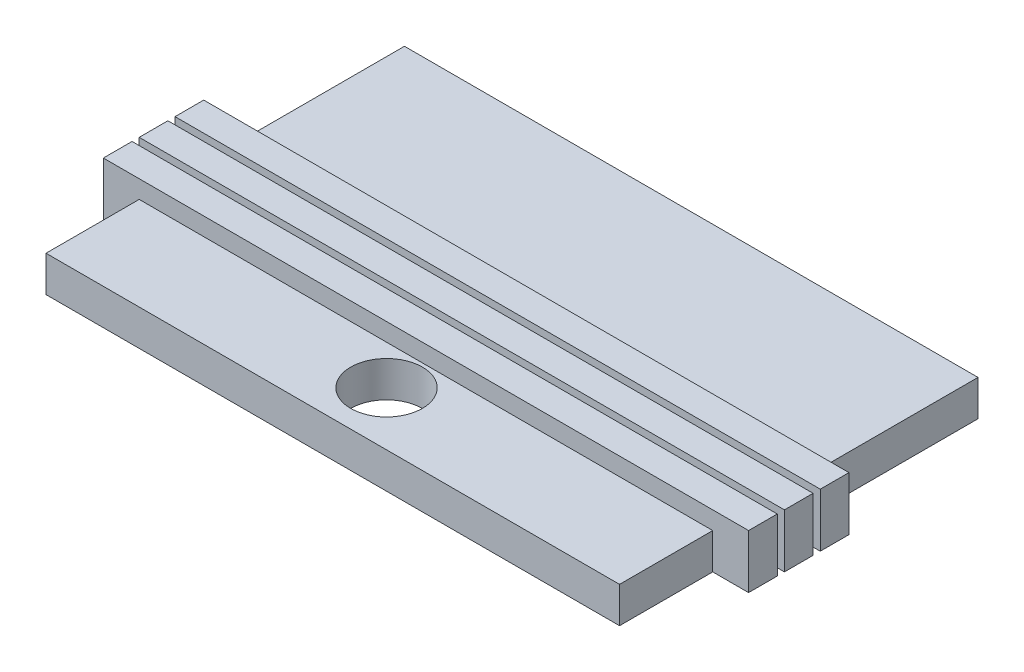
ISO-10303-21;
HEADER;
FILE_DESCRIPTION(('STEP AP214'),'2;1');
FILE_NAME('part.step','',(''),(''),'','','');
FILE_SCHEMA(('AUTOMOTIVE_DESIGN { 1 0 10303 214 1 1 1 1 }'));
ENDSEC;
DATA;
#1=APPLICATION_CONTEXT('core data for automotive mechanical design processes');
#2=APPLICATION_PROTOCOL_DEFINITION('international standard','automotive_design',2000,#1);
#3=PRODUCT_CONTEXT('',#1,'mechanical');
#4=PRODUCT('Part','Part','',(#3));
#5=PRODUCT_RELATED_PRODUCT_CATEGORY('part','',(#4));
#6=PRODUCT_DEFINITION_FORMATION('','',#4);
#7=PRODUCT_DEFINITION_CONTEXT('part definition',#1,'design');
#8=PRODUCT_DEFINITION('design','',#6,#7);
#9=PRODUCT_DEFINITION_SHAPE('','',#8);
#10=(LENGTH_UNIT() NAMED_UNIT(*) SI_UNIT(.MILLI.,.METRE.));
#11=(NAMED_UNIT(*) PLANE_ANGLE_UNIT() SI_UNIT($,.RADIAN.));
#12=(NAMED_UNIT(*) SI_UNIT($,.STERADIAN.) SOLID_ANGLE_UNIT());
#13=UNCERTAINTY_MEASURE_WITH_UNIT(LENGTH_MEASURE(1.E-05),#10,'distance_accuracy_value','');
#14=(GEOMETRIC_REPRESENTATION_CONTEXT(3) GLOBAL_UNCERTAINTY_ASSIGNED_CONTEXT((#13)) GLOBAL_UNIT_ASSIGNED_CONTEXT((#10,
#11,#12)) REPRESENTATION_CONTEXT('',''));
#15=CARTESIAN_POINT('',(0.,0.,0.));
#16=DIRECTION('',(0.,0.,1.));
#17=DIRECTION('',(1.,0.,0.));
#18=AXIS2_PLACEMENT_3D('',#15,#16,#17);
#19=CARTESIAN_POINT('',(-40.,5.,-25.));
#20=DIRECTION('',(1.,0.,0.));
#21=DIRECTION('',(0.,0.,-1.));
#22=AXIS2_PLACEMENT_3D('',#19,#20,#21);
#23=PLANE('',#22);
#24=DIRECTION('',(0.,1.,0.));
#25=VECTOR('',#24,1.);
#26=CARTESIAN_POINT('',(-40.,5.,12.));
#27=LINE('',#26,#25);
#28=CARTESIAN_POINT('',(-40.,0.,12.));
#29=VERTEX_POINT('',#28);
#30=CARTESIAN_POINT('',(-40.,5.,12.));
#31=VERTEX_POINT('',#30);
#32=EDGE_CURVE('E270',#29,#31,#27,.T.);
#33=ORIENTED_EDGE('',*,*,#32,.F.);
#34=DIRECTION('',(0.,0.,1.));
#35=VECTOR('',#34,1.);
#36=CARTESIAN_POINT('',(-40.,0.,-25.));
#37=LINE('',#36,#35);
#38=CARTESIAN_POINT('',(-40.,0.,25.));
#39=VERTEX_POINT('',#38);
#40=EDGE_CURVE('E406',#29,#39,#37,.T.);
#41=ORIENTED_EDGE('',*,*,#40,.T.);
#42=DIRECTION('',(0.,-1.,0.));
#43=VECTOR('',#42,1.);
#44=CARTESIAN_POINT('',(-40.,5.,25.));
#45=LINE('',#44,#43);
#46=CARTESIAN_POINT('',(-40.,5.,25.));
#47=VERTEX_POINT('',#46);
#48=EDGE_CURVE('E45',#47,#39,#45,.T.);
#49=ORIENTED_EDGE('',*,*,#48,.F.);
#50=DIRECTION('',(0.,0.,1.));
#51=VECTOR('',#50,1.);
#52=CARTESIAN_POINT('',(-40.,5.,-25.));
#53=LINE('',#52,#51);
#54=EDGE_CURVE('E391',#31,#47,#53,.T.);
#55=ORIENTED_EDGE('',*,*,#54,.F.);
#56=EDGE_LOOP('',(#33,#41,#49,#55));
#57=FACE_BOUND('',#56,.T.);
#58=ADVANCED_FACE('F36',(#57),#23,.F.);
#59=CARTESIAN_POINT('',(40.,5.,-25.));
#60=DIRECTION('',(1.,0.,0.));
#61=DIRECTION('',(0.,0.,-1.));
#62=AXIS2_PLACEMENT_3D('',#59,#60,#61);
#63=PLANE('',#62);
#64=DIRECTION('',(0.,0.,1.));
#65=VECTOR('',#64,1.);
#66=CARTESIAN_POINT('',(40.,0.,-25.));
#67=LINE('',#66,#65);
#68=CARTESIAN_POINT('',(40.,0.,12.));
#69=VERTEX_POINT('',#68);
#70=CARTESIAN_POINT('',(40.,0.,25.));
#71=VERTEX_POINT('',#70);
#72=EDGE_CURVE('E398',#69,#71,#67,.T.);
#73=ORIENTED_EDGE('',*,*,#72,.F.);
#74=DIRECTION('',(0.,1.,0.));
#75=VECTOR('',#74,1.);
#76=CARTESIAN_POINT('',(40.,5.,12.));
#77=LINE('',#76,#75);
#78=CARTESIAN_POINT('',(40.,5.,12.));
#79=VERTEX_POINT('',#78);
#80=EDGE_CURVE('E254',#69,#79,#77,.T.);
#81=ORIENTED_EDGE('',*,*,#80,.T.);
#82=DIRECTION('',(0.,0.,1.));
#83=VECTOR('',#82,1.);
#84=CARTESIAN_POINT('',(40.,5.,-25.));
#85=LINE('',#84,#83);
#86=CARTESIAN_POINT('',(40.,5.,25.));
#87=VERTEX_POINT('',#86);
#88=EDGE_CURVE('E382',#79,#87,#85,.T.);
#89=ORIENTED_EDGE('',*,*,#88,.T.);
#90=DIRECTION('',(0.,-1.,0.));
#91=VECTOR('',#90,1.);
#92=CARTESIAN_POINT('',(40.,5.,25.));
#93=LINE('',#92,#91);
#94=EDGE_CURVE('E410',#87,#71,#93,.T.);
#95=ORIENTED_EDGE('',*,*,#94,.T.);
#96=EDGE_LOOP('',(#73,#81,#89,#95));
#97=FACE_BOUND('',#96,.T.);
#98=ADVANCED_FACE('F445',(#97),#63,.T.);
#99=CARTESIAN_POINT('',(0.,5.,0.));
#100=DIRECTION('',(0.,-1.,0.));
#101=DIRECTION('',(0.,0.,-1.));
#102=AXIS2_PLACEMENT_3D('',#99,#100,#101);
#103=PLANE('',#102);
#104=CARTESIAN_POINT('',(0.,5.,17.5));
#105=DIRECTION('',(0.,-1.,0.));
#106=DIRECTION('',(0.,0.,-1.));
#107=AXIS2_PLACEMENT_3D('',#104,#105,#106);
#108=CIRCLE('',#107,5.);
#109=CARTESIAN_POINT('',(0.,5.,12.5));
#110=VERTEX_POINT('',#109);
#111=EDGE_CURVE('E234',#110,#110,#108,.T.);
#112=ORIENTED_EDGE('',*,*,#111,.T.);
#113=EDGE_LOOP('',(#112));
#114=FACE_BOUND('',#113,.T.);
#115=DIRECTION('',(1.,0.,0.));
#116=VECTOR('',#115,1.);
#117=CARTESIAN_POINT('',(0.,5.,12.));
#118=LINE('',#117,#116);
#119=EDGE_CURVE('E61',#31,#79,#118,.T.);
#120=ORIENTED_EDGE('',*,*,#119,.F.);
#121=ORIENTED_EDGE('',*,*,#54,.T.);
#122=DIRECTION('',(1.,0.,0.));
#123=VECTOR('',#122,1.);
#124=CARTESIAN_POINT('',(-40.,5.,25.));
#125=LINE('',#124,#123);
#126=EDGE_CURVE('E387',#47,#87,#125,.T.);
#127=ORIENTED_EDGE('',*,*,#126,.T.);
#128=ORIENTED_EDGE('',*,*,#88,.F.);
#129=EDGE_LOOP('',(#120,#121,#127,#128));
#130=FACE_BOUND('',#129,.T.);
#131=ADVANCED_FACE('F436',(#114,#130),#103,.F.);
#132=CARTESIAN_POINT('',(-40.,0.,7.));
#133=VERTEX_POINT('',#132);
#134=CARTESIAN_POINT('',(-40.,0.,8.));
#135=VERTEX_POINT('',#134);
#136=EDGE_CURVE('E483',#133,#135,#37,.T.);
#137=ORIENTED_EDGE('',*,*,#136,.T.);
#138=DIRECTION('',(0.,1.,0.));
#139=VECTOR('',#138,1.);
#140=CARTESIAN_POINT('',(-40.,5.,8.));
#141=LINE('',#140,#139);
#142=CARTESIAN_POINT('',(-40.,5.,8.));
#143=VERTEX_POINT('',#142);
#144=EDGE_CURVE('E251',#135,#143,#141,.T.);
#145=ORIENTED_EDGE('',*,*,#144,.T.);
#146=CARTESIAN_POINT('',(-40.,5.,7.));
#147=VERTEX_POINT('',#146);
#148=EDGE_CURVE('E522',#147,#143,#53,.T.);
#149=ORIENTED_EDGE('',*,*,#148,.F.);
#150=DIRECTION('',(0.,1.,0.));
#151=VECTOR('',#150,1.);
#152=CARTESIAN_POINT('',(-40.,5.,7.));
#153=LINE('',#152,#151);
#154=EDGE_CURVE('E318',#133,#147,#153,.T.);
#155=ORIENTED_EDGE('',*,*,#154,.F.);
#156=EDGE_LOOP('',(#137,#145,#149,#155));
#157=FACE_BOUND('',#156,.T.);
#158=ADVANCED_FACE('F449',(#157),#23,.F.);
#159=DIRECTION('',(0.,1.,0.));
#160=VECTOR('',#159,1.);
#161=CARTESIAN_POINT('',(40.,5.,8.));
#162=LINE('',#161,#160);
#163=CARTESIAN_POINT('',(40.,0.,8.));
#164=VERTEX_POINT('',#163);
#165=CARTESIAN_POINT('',(40.,5.,8.));
#166=VERTEX_POINT('',#165);
#167=EDGE_CURVE('E274',#164,#166,#162,.T.);
#168=ORIENTED_EDGE('',*,*,#167,.F.);
#169=CARTESIAN_POINT('',(40.,0.,7.));
#170=VERTEX_POINT('',#169);
#171=EDGE_CURVE('E510',#170,#164,#67,.T.);
#172=ORIENTED_EDGE('',*,*,#171,.F.);
#173=DIRECTION('',(0.,1.,0.));
#174=VECTOR('',#173,1.);
#175=CARTESIAN_POINT('',(40.,5.,7.));
#176=LINE('',#175,#174);
#177=CARTESIAN_POINT('',(40.,5.,7.));
#178=VERTEX_POINT('',#177);
#179=EDGE_CURVE('E315',#170,#178,#176,.T.);
#180=ORIENTED_EDGE('',*,*,#179,.T.);
#181=EDGE_CURVE('E524',#178,#166,#85,.T.);
#182=ORIENTED_EDGE('',*,*,#181,.T.);
#183=EDGE_LOOP('',(#168,#172,#180,#182));
#184=FACE_BOUND('',#183,.T.);
#185=ADVANCED_FACE('F460',(#184),#63,.T.);
#186=ORIENTED_EDGE('',*,*,#148,.T.);
#187=DIRECTION('',(1.,0.,0.));
#188=VECTOR('',#187,1.);
#189=CARTESIAN_POINT('',(0.,5.,8.));
#190=LINE('',#189,#188);
#191=EDGE_CURVE('E53',#143,#166,#190,.T.);
#192=ORIENTED_EDGE('',*,*,#191,.T.);
#193=ORIENTED_EDGE('',*,*,#181,.F.);
#194=DIRECTION('',(1.,0.,0.));
#195=VECTOR('',#194,1.);
#196=CARTESIAN_POINT('',(0.,5.,7.));
#197=LINE('',#196,#195);
#198=EDGE_CURVE('E304',#147,#178,#197,.T.);
#199=ORIENTED_EDGE('',*,*,#198,.F.);
#200=EDGE_LOOP('',(#186,#192,#193,#199));
#201=FACE_BOUND('',#200,.T.);
#202=ADVANCED_FACE('F451',(#201),#103,.F.);
#203=CARTESIAN_POINT('',(-40.,0.,2.));
#204=VERTEX_POINT('',#203);
#205=CARTESIAN_POINT('',(-40.,0.,3.));
#206=VERTEX_POINT('',#205);
#207=EDGE_CURVE('E407',#204,#206,#37,.T.);
#208=ORIENTED_EDGE('',*,*,#207,.T.);
#209=DIRECTION('',(0.,1.,0.));
#210=VECTOR('',#209,1.);
#211=CARTESIAN_POINT('',(-40.,5.,3.));
#212=LINE('',#211,#210);
#213=CARTESIAN_POINT('',(-40.,5.,3.));
#214=VERTEX_POINT('',#213);
#215=EDGE_CURVE('E326',#206,#214,#212,.T.);
#216=ORIENTED_EDGE('',*,*,#215,.T.);
#217=CARTESIAN_POINT('',(-40.,5.,2.));
#218=VERTEX_POINT('',#217);
#219=EDGE_CURVE('E395',#218,#214,#53,.T.);
#220=ORIENTED_EDGE('',*,*,#219,.F.);
#221=DIRECTION('',(0.,1.,0.));
#222=VECTOR('',#221,1.);
#223=CARTESIAN_POINT('',(-40.,5.,2.));
#224=LINE('',#223,#222);
#225=EDGE_CURVE('E368',#204,#218,#224,.T.);
#226=ORIENTED_EDGE('',*,*,#225,.F.);
#227=EDGE_LOOP('',(#208,#216,#220,#226));
#228=FACE_BOUND('',#227,.T.);
#229=ADVANCED_FACE('F464',(#228),#23,.F.);
#230=DIRECTION('',(0.,1.,0.));
#231=VECTOR('',#230,1.);
#232=CARTESIAN_POINT('',(40.,5.,3.));
#233=LINE('',#232,#231);
#234=CARTESIAN_POINT('',(40.,0.,3.));
#235=VERTEX_POINT('',#234);
#236=CARTESIAN_POINT('',(40.,5.,3.));
#237=VERTEX_POINT('',#236);
#238=EDGE_CURVE('E323',#235,#237,#233,.T.);
#239=ORIENTED_EDGE('',*,*,#238,.F.);
#240=CARTESIAN_POINT('',(40.,0.,2.));
#241=VERTEX_POINT('',#240);
#242=EDGE_CURVE('E403',#241,#235,#67,.T.);
#243=ORIENTED_EDGE('',*,*,#242,.F.);
#244=DIRECTION('',(0.,1.,0.));
#245=VECTOR('',#244,1.);
#246=CARTESIAN_POINT('',(40.,5.,2.));
#247=LINE('',#246,#245);
#248=CARTESIAN_POINT('',(40.,5.,2.));
#249=VERTEX_POINT('',#248);
#250=EDGE_CURVE('E365',#241,#249,#247,.T.);
#251=ORIENTED_EDGE('',*,*,#250,.T.);
#252=EDGE_CURVE('E388',#249,#237,#85,.T.);
#253=ORIENTED_EDGE('',*,*,#252,.T.);
#254=EDGE_LOOP('',(#239,#243,#251,#253));
#255=FACE_BOUND('',#254,.T.);
#256=ADVANCED_FACE('F446',(#255),#63,.T.);
#257=ORIENTED_EDGE('',*,*,#219,.T.);
#258=DIRECTION('',(1.,0.,0.));
#259=VECTOR('',#258,1.);
#260=CARTESIAN_POINT('',(0.,5.,3.));
#261=LINE('',#260,#259);
#262=EDGE_CURVE('E321',#214,#237,#261,.T.);
#263=ORIENTED_EDGE('',*,*,#262,.T.);
#264=ORIENTED_EDGE('',*,*,#252,.F.);
#265=DIRECTION('',(1.,0.,0.));
#266=VECTOR('',#265,1.);
#267=CARTESIAN_POINT('',(0.,5.,2.));
#268=LINE('',#267,#266);
#269=EDGE_CURVE('E354',#218,#249,#268,.T.);
#270=ORIENTED_EDGE('',*,*,#269,.F.);
#271=EDGE_LOOP('',(#257,#263,#264,#270));
#272=FACE_BOUND('',#271,.T.);
#273=ADVANCED_FACE('F437',(#272),#103,.F.);
#274=CARTESIAN_POINT('',(-40.,5.,-25.));
#275=DIRECTION('',(0.,0.,-1.));
#276=DIRECTION('',(-1.,0.,0.));
#277=AXIS2_PLACEMENT_3D('',#274,#275,#276);
#278=PLANE('',#277);
#279=DIRECTION('',(1.,0.,0.));
#280=VECTOR('',#279,1.);
#281=CARTESIAN_POINT('',(-40.,0.,-25.));
#282=LINE('',#281,#280);
#283=CARTESIAN_POINT('',(-40.,0.,-25.));
#284=VERTEX_POINT('',#283);
#285=CARTESIAN_POINT('',(40.,0.,-25.));
#286=VERTEX_POINT('',#285);
#287=EDGE_CURVE('E378',#284,#286,#282,.T.);
#288=ORIENTED_EDGE('',*,*,#287,.F.);
#289=DIRECTION('',(0.,-1.,0.));
#290=VECTOR('',#289,1.);
#291=CARTESIAN_POINT('',(-40.,5.,-25.));
#292=LINE('',#291,#290);
#293=CARTESIAN_POINT('',(-40.,5.,-25.));
#294=VERTEX_POINT('',#293);
#295=EDGE_CURVE('E11',#294,#284,#292,.T.);
#296=ORIENTED_EDGE('',*,*,#295,.F.);
#297=DIRECTION('',(1.,0.,0.));
#298=VECTOR('',#297,1.);
#299=CARTESIAN_POINT('',(-40.,5.,-25.));
#300=LINE('',#299,#298);
#301=CARTESIAN_POINT('',(40.,5.,-25.));
#302=VERTEX_POINT('',#301);
#303=EDGE_CURVE('E379',#294,#302,#300,.T.);
#304=ORIENTED_EDGE('',*,*,#303,.T.);
#305=DIRECTION('',(0.,-1.,0.));
#306=VECTOR('',#305,1.);
#307=CARTESIAN_POINT('',(40.,5.,-25.));
#308=LINE('',#307,#306);
#309=EDGE_CURVE('E40',#302,#286,#308,.T.);
#310=ORIENTED_EDGE('',*,*,#309,.T.);
#311=EDGE_LOOP('',(#288,#296,#304,#310));
#312=FACE_BOUND('',#311,.T.);
#313=ADVANCED_FACE('F38',(#312),#278,.T.);
#314=CARTESIAN_POINT('',(-40.,0.,-2.));
#315=VERTEX_POINT('',#314);
#316=EDGE_CURVE('E383',#284,#315,#37,.T.);
#317=ORIENTED_EDGE('',*,*,#316,.T.);
#318=DIRECTION('',(0.,1.,0.));
#319=VECTOR('',#318,1.);
#320=CARTESIAN_POINT('',(-40.,5.,-2.));
#321=LINE('',#320,#319);
#322=CARTESIAN_POINT('',(-40.,5.,-2.));
#323=VERTEX_POINT('',#322);
#324=EDGE_CURVE('E376',#315,#323,#321,.T.);
#325=ORIENTED_EDGE('',*,*,#324,.T.);
#326=EDGE_CURVE('E392',#294,#323,#53,.T.);
#327=ORIENTED_EDGE('',*,*,#326,.F.);
#328=ORIENTED_EDGE('',*,*,#295,.T.);
#329=EDGE_LOOP('',(#317,#325,#327,#328));
#330=FACE_BOUND('',#329,.T.);
#331=ADVANCED_FACE('F427',(#330),#23,.F.);
#332=CARTESIAN_POINT('',(-40.,5.,25.));
#333=DIRECTION('',(0.,0.,-1.));
#334=DIRECTION('',(-1.,0.,0.));
#335=AXIS2_PLACEMENT_3D('',#332,#333,#334);
#336=PLANE('',#335);
#337=DIRECTION('',(1.,0.,0.));
#338=VECTOR('',#337,1.);
#339=CARTESIAN_POINT('',(-40.,0.,25.));
#340=LINE('',#339,#338);
#341=EDGE_CURVE('E402',#39,#71,#340,.T.);
#342=ORIENTED_EDGE('',*,*,#341,.T.);
#343=ORIENTED_EDGE('',*,*,#94,.F.);
#344=ORIENTED_EDGE('',*,*,#126,.F.);
#345=ORIENTED_EDGE('',*,*,#48,.T.);
#346=EDGE_LOOP('',(#342,#343,#344,#345));
#347=FACE_BOUND('',#346,.T.);
#348=ADVANCED_FACE('F444',(#347),#336,.F.);
#349=DIRECTION('',(0.,1.,0.));
#350=VECTOR('',#349,1.);
#351=CARTESIAN_POINT('',(40.,5.,-2.));
#352=LINE('',#351,#350);
#353=CARTESIAN_POINT('',(40.,0.,-2.));
#354=VERTEX_POINT('',#353);
#355=CARTESIAN_POINT('',(40.,5.,-2.));
#356=VERTEX_POINT('',#355);
#357=EDGE_CURVE('E373',#354,#356,#352,.T.);
#358=ORIENTED_EDGE('',*,*,#357,.F.);
#359=EDGE_CURVE('E399',#286,#354,#67,.T.);
#360=ORIENTED_EDGE('',*,*,#359,.F.);
#361=ORIENTED_EDGE('',*,*,#309,.F.);
#362=EDGE_CURVE('E384',#302,#356,#85,.T.);
#363=ORIENTED_EDGE('',*,*,#362,.T.);
#364=EDGE_LOOP('',(#358,#360,#361,#363));
#365=FACE_BOUND('',#364,.T.);
#366=ADVANCED_FACE('F420',(#365),#63,.T.);
#367=ORIENTED_EDGE('',*,*,#326,.T.);
#368=DIRECTION('',(1.,0.,0.));
#369=VECTOR('',#368,1.);
#370=CARTESIAN_POINT('',(0.,5.,-2.));
#371=LINE('',#370,#369);
#372=EDGE_CURVE('E371',#323,#356,#371,.T.);
#373=ORIENTED_EDGE('',*,*,#372,.T.);
#374=ORIENTED_EDGE('',*,*,#362,.F.);
#375=ORIENTED_EDGE('',*,*,#303,.F.);
#376=EDGE_LOOP('',(#367,#373,#374,#375));
#377=FACE_BOUND('',#376,.T.);
#378=ADVANCED_FACE('F433',(#377),#103,.F.);
#379=CARTESIAN_POINT('',(0.,0.,0.));
#380=DIRECTION('',(0.,-1.,0.));
#381=DIRECTION('',(0.,0.,-1.));
#382=AXIS2_PLACEMENT_3D('',#379,#380,#381);
#383=PLANE('',#382);
#384=CARTESIAN_POINT('',(0.,0.,17.5));
#385=DIRECTION('',(0.,1.,0.));
#386=DIRECTION('',(0.,0.,1.));
#387=AXIS2_PLACEMENT_3D('',#384,#385,#386);
#388=CIRCLE('',#387,5.);
#389=CARTESIAN_POINT('',(0.,0.,22.5));
#390=VERTEX_POINT('',#389);
#391=EDGE_CURVE('E536',#390,#390,#388,.T.);
#392=ORIENTED_EDGE('',*,*,#391,.T.);
#393=EDGE_LOOP('',(#392));
#394=FACE_BOUND('',#393,.T.);
#395=ORIENTED_EDGE('',*,*,#171,.T.);
#396=DIRECTION('',(1.,0.,0.));
#397=VECTOR('',#396,1.);
#398=CARTESIAN_POINT('',(-44.9999999999999,0.,8.));
#399=LINE('',#398,#397);
#400=CARTESIAN_POINT('',(45.0000000000001,0.,8.));
#401=VERTEX_POINT('',#400);
#402=EDGE_CURVE('E252',#164,#401,#399,.T.);
#403=ORIENTED_EDGE('',*,*,#402,.T.);
#404=DIRECTION('',(0.,0.,1.));
#405=VECTOR('',#404,1.);
#406=CARTESIAN_POINT('',(45.0000000000001,0.,8.));
#407=LINE('',#406,#405);
#408=CARTESIAN_POINT('',(45.0000000000001,0.,12.));
#409=VERTEX_POINT('',#408);
#410=EDGE_CURVE('E256',#401,#409,#407,.T.);
#411=ORIENTED_EDGE('',*,*,#410,.T.);
#412=DIRECTION('',(1.,0.,0.));
#413=VECTOR('',#412,1.);
#414=CARTESIAN_POINT('',(-44.9999999999999,0.,12.));
#415=LINE('',#414,#413);
#416=EDGE_CURVE('E246',#69,#409,#415,.T.);
#417=ORIENTED_EDGE('',*,*,#416,.F.);
#418=ORIENTED_EDGE('',*,*,#72,.T.);
#419=ORIENTED_EDGE('',*,*,#341,.F.);
#420=ORIENTED_EDGE('',*,*,#40,.F.);
#421=CARTESIAN_POINT('',(-44.9999999999999,0.,12.));
#422=VERTEX_POINT('',#421);
#423=EDGE_CURVE('E245',#422,#29,#415,.T.);
#424=ORIENTED_EDGE('',*,*,#423,.F.);
#425=DIRECTION('',(0.,0.,1.));
#426=VECTOR('',#425,1.);
#427=CARTESIAN_POINT('',(-44.9999999999999,0.,8.));
#428=LINE('',#427,#426);
#429=CARTESIAN_POINT('',(-44.9999999999999,0.,8.));
#430=VERTEX_POINT('',#429);
#431=EDGE_CURVE('E226',#430,#422,#428,.T.);
#432=ORIENTED_EDGE('',*,*,#431,.F.);
#433=EDGE_CURVE('E242',#430,#135,#399,.T.);
#434=ORIENTED_EDGE('',*,*,#433,.T.);
#435=ORIENTED_EDGE('',*,*,#136,.F.);
#436=DIRECTION('',(1.,0.,0.));
#437=VECTOR('',#436,1.);
#438=CARTESIAN_POINT('',(-45.,0.,7.));
#439=LINE('',#438,#437);
#440=CARTESIAN_POINT('',(-45.,0.,7.));
#441=VERTEX_POINT('',#440);
#442=EDGE_CURVE('E294',#441,#133,#439,.T.);
#443=ORIENTED_EDGE('',*,*,#442,.F.);
#444=DIRECTION('',(0.,0.,1.));
#445=VECTOR('',#444,1.);
#446=CARTESIAN_POINT('',(-45.,0.,3.));
#447=LINE('',#446,#445);
#448=CARTESIAN_POINT('',(-45.,0.,3.));
#449=VERTEX_POINT('',#448);
#450=EDGE_CURVE('E290',#449,#441,#447,.T.);
#451=ORIENTED_EDGE('',*,*,#450,.F.);
#452=DIRECTION('',(1.,0.,0.));
#453=VECTOR('',#452,1.);
#454=CARTESIAN_POINT('',(-45.,0.,3.));
#455=LINE('',#454,#453);
#456=EDGE_CURVE('E301',#449,#206,#455,.T.);
#457=ORIENTED_EDGE('',*,*,#456,.T.);
#458=ORIENTED_EDGE('',*,*,#207,.F.);
#459=DIRECTION('',(1.,0.,0.));
#460=VECTOR('',#459,1.);
#461=CARTESIAN_POINT('',(-45.,0.,2.));
#462=LINE('',#461,#460);
#463=CARTESIAN_POINT('',(-45.,0.,2.));
#464=VERTEX_POINT('',#463);
#465=EDGE_CURVE('E348',#464,#204,#462,.T.);
#466=ORIENTED_EDGE('',*,*,#465,.F.);
#467=DIRECTION('',(0.,0.,1.));
#468=VECTOR('',#467,1.);
#469=CARTESIAN_POINT('',(-45.,0.,-2.));
#470=LINE('',#469,#468);
#471=CARTESIAN_POINT('',(-45.,0.,-2.));
#472=VERTEX_POINT('',#471);
#473=EDGE_CURVE('E333',#472,#464,#470,.T.);
#474=ORIENTED_EDGE('',*,*,#473,.F.);
#475=DIRECTION('',(1.,0.,0.));
#476=VECTOR('',#475,1.);
#477=CARTESIAN_POINT('',(-45.,0.,-2.));
#478=LINE('',#477,#476);
#479=EDGE_CURVE('E341',#472,#315,#478,.T.);
#480=ORIENTED_EDGE('',*,*,#479,.T.);
#481=ORIENTED_EDGE('',*,*,#316,.F.);
#482=ORIENTED_EDGE('',*,*,#287,.T.);
#483=ORIENTED_EDGE('',*,*,#359,.T.);
#484=CARTESIAN_POINT('',(45.,0.,-2.));
#485=VERTEX_POINT('',#484);
#486=EDGE_CURVE('E328',#354,#485,#478,.T.);
#487=ORIENTED_EDGE('',*,*,#486,.T.);
#488=DIRECTION('',(0.,0.,1.));
#489=VECTOR('',#488,1.);
#490=CARTESIAN_POINT('',(45.,0.,-2.));
#491=LINE('',#490,#489);
#492=CARTESIAN_POINT('',(45.,0.,2.));
#493=VERTEX_POINT('',#492);
#494=EDGE_CURVE('E344',#485,#493,#491,.T.);
#495=ORIENTED_EDGE('',*,*,#494,.T.);
#496=EDGE_CURVE('E347',#241,#493,#462,.T.);
#497=ORIENTED_EDGE('',*,*,#496,.F.);
#498=ORIENTED_EDGE('',*,*,#242,.T.);
#499=CARTESIAN_POINT('',(45.,0.,3.));
#500=VERTEX_POINT('',#499);
#501=EDGE_CURVE('E300',#235,#500,#455,.T.);
#502=ORIENTED_EDGE('',*,*,#501,.T.);
#503=DIRECTION('',(0.,0.,1.));
#504=VECTOR('',#503,1.);
#505=CARTESIAN_POINT('',(45.,0.,3.));
#506=LINE('',#505,#504);
#507=CARTESIAN_POINT('',(45.,0.,7.));
#508=VERTEX_POINT('',#507);
#509=EDGE_CURVE('E297',#500,#508,#506,.T.);
#510=ORIENTED_EDGE('',*,*,#509,.T.);
#511=EDGE_CURVE('E292',#170,#508,#439,.T.);
#512=ORIENTED_EDGE('',*,*,#511,.F.);
#513=EDGE_LOOP('',(#395,#403,#411,#417,#418,#419,#420,#424,#432,#434,#435,#443,#451,#457,#458,
#466,#474,#480,#481,#482,#483,#487,#495,#497,#498,#502,#510,#512));
#514=FACE_BOUND('',#513,.T.);
#515=ADVANCED_FACE('F240',(#394,#514),#383,.T.);
#516=CARTESIAN_POINT('',(-45.,7.5,-2.));
#517=DIRECTION('',(0.,0.,-1.));
#518=DIRECTION('',(-1.,0.,0.));
#519=AXIS2_PLACEMENT_3D('',#516,#517,#518);
#520=PLANE('',#519);
#521=ORIENTED_EDGE('',*,*,#324,.F.);
#522=ORIENTED_EDGE('',*,*,#479,.F.);
#523=DIRECTION('',(0.,-1.,0.));
#524=VECTOR('',#523,1.);
#525=CARTESIAN_POINT('',(-45.,7.5,-2.));
#526=LINE('',#525,#524);
#527=CARTESIAN_POINT('',(-45.,7.5,-2.));
#528=VERTEX_POINT('',#527);
#529=EDGE_CURVE('E352',#528,#472,#526,.T.);
#530=ORIENTED_EDGE('',*,*,#529,.F.);
#531=DIRECTION('',(1.,0.,0.));
#532=VECTOR('',#531,1.);
#533=CARTESIAN_POINT('',(-45.,7.5,-2.));
#534=LINE('',#533,#532);
#535=CARTESIAN_POINT('',(45.,7.5,-2.));
#536=VERTEX_POINT('',#535);
#537=EDGE_CURVE('E329',#528,#536,#534,.T.);
#538=ORIENTED_EDGE('',*,*,#537,.T.);
#539=DIRECTION('',(0.,-1.,0.));
#540=VECTOR('',#539,1.);
#541=CARTESIAN_POINT('',(45.,7.5,-2.));
#542=LINE('',#541,#540);
#543=EDGE_CURVE('E340',#536,#485,#542,.T.);
#544=ORIENTED_EDGE('',*,*,#543,.T.);
#545=ORIENTED_EDGE('',*,*,#486,.F.);
#546=ORIENTED_EDGE('',*,*,#357,.T.);
#547=ORIENTED_EDGE('',*,*,#372,.F.);
#548=EDGE_LOOP('',(#521,#522,#530,#538,#544,#545,#546,#547));
#549=FACE_BOUND('',#548,.T.);
#550=ADVANCED_FACE('F431',(#549),#520,.T.);
#551=CARTESIAN_POINT('',(-45.,7.5,2.));
#552=DIRECTION('',(0.,0.,-1.));
#553=DIRECTION('',(-1.,0.,0.));
#554=AXIS2_PLACEMENT_3D('',#551,#552,#553);
#555=PLANE('',#554);
#556=ORIENTED_EDGE('',*,*,#465,.T.);
#557=ORIENTED_EDGE('',*,*,#225,.T.);
#558=ORIENTED_EDGE('',*,*,#269,.T.);
#559=ORIENTED_EDGE('',*,*,#250,.F.);
#560=ORIENTED_EDGE('',*,*,#496,.T.);
#561=DIRECTION('',(0.,-1.,0.));
#562=VECTOR('',#561,1.);
#563=CARTESIAN_POINT('',(45.,7.5,2.));
#564=LINE('',#563,#562);
#565=CARTESIAN_POINT('',(45.,7.5,2.));
#566=VERTEX_POINT('',#565);
#567=EDGE_CURVE('E358',#566,#493,#564,.T.);
#568=ORIENTED_EDGE('',*,*,#567,.F.);
#569=DIRECTION('',(1.,0.,0.));
#570=VECTOR('',#569,1.);
#571=CARTESIAN_POINT('',(-45.,7.5,2.));
#572=LINE('',#571,#570);
#573=CARTESIAN_POINT('',(-45.,7.5,2.));
#574=VERTEX_POINT('',#573);
#575=EDGE_CURVE('E336',#574,#566,#572,.T.);
#576=ORIENTED_EDGE('',*,*,#575,.F.);
#577=DIRECTION('',(0.,-1.,0.));
#578=VECTOR('',#577,1.);
#579=CARTESIAN_POINT('',(-45.,7.5,2.));
#580=LINE('',#579,#578);
#581=EDGE_CURVE('E355',#574,#464,#580,.T.);
#582=ORIENTED_EDGE('',*,*,#581,.T.);
#583=EDGE_LOOP('',(#556,#557,#558,#559,#560,#568,#576,#582));
#584=FACE_BOUND('',#583,.T.);
#585=ADVANCED_FACE('F579',(#584),#555,.F.);
#586=CARTESIAN_POINT('',(-45.,7.5,-2.));
#587=DIRECTION('',(1.,0.,0.));
#588=DIRECTION('',(0.,0.,-1.));
#589=AXIS2_PLACEMENT_3D('',#586,#587,#588);
#590=PLANE('',#589);
#591=ORIENTED_EDGE('',*,*,#473,.T.);
#592=ORIENTED_EDGE('',*,*,#581,.F.);
#593=DIRECTION('',(0.,0.,1.));
#594=VECTOR('',#593,1.);
#595=CARTESIAN_POINT('',(-45.,7.5,-2.));
#596=LINE('',#595,#594);
#597=EDGE_CURVE('E338',#528,#574,#596,.T.);
#598=ORIENTED_EDGE('',*,*,#597,.F.);
#599=ORIENTED_EDGE('',*,*,#529,.T.);
#600=EDGE_LOOP('',(#591,#592,#598,#599));
#601=FACE_BOUND('',#600,.T.);
#602=ADVANCED_FACE('F576',(#601),#590,.F.);
#603=CARTESIAN_POINT('',(45.,7.5,-2.));
#604=DIRECTION('',(1.,0.,0.));
#605=DIRECTION('',(0.,0.,-1.));
#606=AXIS2_PLACEMENT_3D('',#603,#604,#605);
#607=PLANE('',#606);
#608=ORIENTED_EDGE('',*,*,#494,.F.);
#609=ORIENTED_EDGE('',*,*,#543,.F.);
#610=DIRECTION('',(0.,0.,1.));
#611=VECTOR('',#610,1.);
#612=CARTESIAN_POINT('',(45.,7.5,-2.));
#613=LINE('',#612,#611);
#614=EDGE_CURVE('E332',#536,#566,#613,.T.);
#615=ORIENTED_EDGE('',*,*,#614,.T.);
#616=ORIENTED_EDGE('',*,*,#567,.T.);
#617=EDGE_LOOP('',(#608,#609,#615,#616));
#618=FACE_BOUND('',#617,.T.);
#619=ADVANCED_FACE('F574',(#618),#607,.T.);
#620=CARTESIAN_POINT('',(0.,7.5,0.));
#621=DIRECTION('',(0.,-1.,0.));
#622=DIRECTION('',(0.,0.,-1.));
#623=AXIS2_PLACEMENT_3D('',#620,#621,#622);
#624=PLANE('',#623);
#625=ORIENTED_EDGE('',*,*,#537,.F.);
#626=ORIENTED_EDGE('',*,*,#597,.T.);
#627=ORIENTED_EDGE('',*,*,#575,.T.);
#628=ORIENTED_EDGE('',*,*,#614,.F.);
#629=EDGE_LOOP('',(#625,#626,#627,#628));
#630=FACE_BOUND('',#629,.T.);
#631=ADVANCED_FACE('F563',(#630),#624,.F.);
#632=CARTESIAN_POINT('',(-45.,7.5,3.));
#633=DIRECTION('',(0.,0.,-1.));
#634=DIRECTION('',(-1.,0.,0.));
#635=AXIS2_PLACEMENT_3D('',#632,#633,#634);
#636=PLANE('',#635);
#637=ORIENTED_EDGE('',*,*,#215,.F.);
#638=ORIENTED_EDGE('',*,*,#456,.F.);
#639=DIRECTION('',(0.,-1.,0.));
#640=VECTOR('',#639,1.);
#641=CARTESIAN_POINT('',(-45.,7.5,3.));
#642=LINE('',#641,#640);
#643=CARTESIAN_POINT('',(-45.,7.5,3.));
#644=VERTEX_POINT('',#643);
#645=EDGE_CURVE('E278',#644,#449,#642,.T.);
#646=ORIENTED_EDGE('',*,*,#645,.F.);
#647=DIRECTION('',(1.,0.,0.));
#648=VECTOR('',#647,1.);
#649=CARTESIAN_POINT('',(-45.,7.5,3.));
#650=LINE('',#649,#648);
#651=CARTESIAN_POINT('',(45.,7.5,3.));
#652=VERTEX_POINT('',#651);
#653=EDGE_CURVE('E293',#644,#652,#650,.T.);
#654=ORIENTED_EDGE('',*,*,#653,.T.);
#655=DIRECTION('',(0.,-1.,0.));
#656=VECTOR('',#655,1.);
#657=CARTESIAN_POINT('',(45.,7.5,3.));
#658=LINE('',#657,#656);
#659=EDGE_CURVE('E279',#652,#500,#658,.T.);
#660=ORIENTED_EDGE('',*,*,#659,.T.);
#661=ORIENTED_EDGE('',*,*,#501,.F.);
#662=ORIENTED_EDGE('',*,*,#238,.T.);
#663=ORIENTED_EDGE('',*,*,#262,.F.);
#664=EDGE_LOOP('',(#637,#638,#646,#654,#660,#661,#662,#663));
#665=FACE_BOUND('',#664,.T.);
#666=ADVANCED_FACE('F487',(#665),#636,.T.);
#667=CARTESIAN_POINT('',(-45.,7.5,7.));
#668=DIRECTION('',(0.,0.,-1.));
#669=DIRECTION('',(-1.,0.,0.));
#670=AXIS2_PLACEMENT_3D('',#667,#668,#669);
#671=PLANE('',#670);
#672=ORIENTED_EDGE('',*,*,#442,.T.);
#673=ORIENTED_EDGE('',*,*,#154,.T.);
#674=ORIENTED_EDGE('',*,*,#198,.T.);
#675=ORIENTED_EDGE('',*,*,#179,.F.);
#676=ORIENTED_EDGE('',*,*,#511,.T.);
#677=DIRECTION('',(0.,-1.,0.));
#678=VECTOR('',#677,1.);
#679=CARTESIAN_POINT('',(45.,7.5,7.));
#680=LINE('',#679,#678);
#681=CARTESIAN_POINT('',(45.,7.5,7.));
#682=VERTEX_POINT('',#681);
#683=EDGE_CURVE('E283',#682,#508,#680,.T.);
#684=ORIENTED_EDGE('',*,*,#683,.F.);
#685=DIRECTION('',(1.,0.,0.));
#686=VECTOR('',#685,1.);
#687=CARTESIAN_POINT('',(-45.,7.5,7.));
#688=LINE('',#687,#686);
#689=CARTESIAN_POINT('',(-45.,7.5,7.));
#690=VERTEX_POINT('',#689);
#691=EDGE_CURVE('E306',#690,#682,#688,.T.);
#692=ORIENTED_EDGE('',*,*,#691,.F.);
#693=DIRECTION('',(0.,-1.,0.));
#694=VECTOR('',#693,1.);
#695=CARTESIAN_POINT('',(-45.,7.5,7.));
#696=LINE('',#695,#694);
#697=EDGE_CURVE('E286',#690,#441,#696,.T.);
#698=ORIENTED_EDGE('',*,*,#697,.T.);
#699=EDGE_LOOP('',(#672,#673,#674,#675,#676,#684,#692,#698));
#700=FACE_BOUND('',#699,.T.);
#701=ADVANCED_FACE('F496',(#700),#671,.F.);
#702=CARTESIAN_POINT('',(-45.,7.5,3.));
#703=DIRECTION('',(1.,0.,0.));
#704=DIRECTION('',(0.,0.,-1.));
#705=AXIS2_PLACEMENT_3D('',#702,#703,#704);
#706=PLANE('',#705);
#707=ORIENTED_EDGE('',*,*,#450,.T.);
#708=ORIENTED_EDGE('',*,*,#697,.F.);
#709=DIRECTION('',(0.,0.,1.));
#710=VECTOR('',#709,1.);
#711=CARTESIAN_POINT('',(-45.,7.5,3.));
#712=LINE('',#711,#710);
#713=EDGE_CURVE('E282',#644,#690,#712,.T.);
#714=ORIENTED_EDGE('',*,*,#713,.F.);
#715=ORIENTED_EDGE('',*,*,#645,.T.);
#716=EDGE_LOOP('',(#707,#708,#714,#715));
#717=FACE_BOUND('',#716,.T.);
#718=ADVANCED_FACE('F492',(#717),#706,.F.);
#719=CARTESIAN_POINT('',(45.,7.5,3.));
#720=DIRECTION('',(1.,0.,0.));
#721=DIRECTION('',(0.,0.,-1.));
#722=AXIS2_PLACEMENT_3D('',#719,#720,#721);
#723=PLANE('',#722);
#724=ORIENTED_EDGE('',*,*,#509,.F.);
#725=ORIENTED_EDGE('',*,*,#659,.F.);
#726=DIRECTION('',(0.,0.,1.));
#727=VECTOR('',#726,1.);
#728=CARTESIAN_POINT('',(45.,7.5,3.));
#729=LINE('',#728,#727);
#730=EDGE_CURVE('E308',#652,#682,#729,.T.);
#731=ORIENTED_EDGE('',*,*,#730,.T.);
#732=ORIENTED_EDGE('',*,*,#683,.T.);
#733=EDGE_LOOP('',(#724,#725,#731,#732));
#734=FACE_BOUND('',#733,.T.);
#735=ADVANCED_FACE('F505',(#734),#723,.T.);
#736=CARTESIAN_POINT('',(0.,7.5,0.));
#737=DIRECTION('',(0.,-1.,0.));
#738=DIRECTION('',(0.,0.,-1.));
#739=AXIS2_PLACEMENT_3D('',#736,#737,#738);
#740=PLANE('',#739);
#741=ORIENTED_EDGE('',*,*,#653,.F.);
#742=ORIENTED_EDGE('',*,*,#713,.T.);
#743=ORIENTED_EDGE('',*,*,#691,.T.);
#744=ORIENTED_EDGE('',*,*,#730,.F.);
#745=EDGE_LOOP('',(#741,#742,#743,#744));
#746=FACE_BOUND('',#745,.T.);
#747=ADVANCED_FACE('F501',(#746),#740,.F.);
#748=CARTESIAN_POINT('',(-44.9999999999999,7.5,8.));
#749=DIRECTION('',(0.,0.,-1.));
#750=DIRECTION('',(-1.,0.,0.));
#751=AXIS2_PLACEMENT_3D('',#748,#749,#750);
#752=PLANE('',#751);
#753=ORIENTED_EDGE('',*,*,#144,.F.);
#754=ORIENTED_EDGE('',*,*,#433,.F.);
#755=DIRECTION('',(0.,-1.,0.));
#756=VECTOR('',#755,1.);
#757=CARTESIAN_POINT('',(-44.9999999999999,7.5,8.));
#758=LINE('',#757,#756);
#759=CARTESIAN_POINT('',(-44.9999999999999,7.5,8.));
#760=VERTEX_POINT('',#759);
#761=EDGE_CURVE('E222',#760,#430,#758,.T.);
#762=ORIENTED_EDGE('',*,*,#761,.F.);
#763=DIRECTION('',(1.,0.,0.));
#764=VECTOR('',#763,1.);
#765=CARTESIAN_POINT('',(-44.9999999999999,7.5,8.));
#766=LINE('',#765,#764);
#767=CARTESIAN_POINT('',(45.0000000000001,7.5,8.));
#768=VERTEX_POINT('',#767);
#769=EDGE_CURVE('E247',#760,#768,#766,.T.);
#770=ORIENTED_EDGE('',*,*,#769,.T.);
#771=DIRECTION('',(0.,-1.,0.));
#772=VECTOR('',#771,1.);
#773=CARTESIAN_POINT('',(45.0000000000001,7.5,8.));
#774=LINE('',#773,#772);
#775=EDGE_CURVE('E262',#768,#401,#774,.T.);
#776=ORIENTED_EDGE('',*,*,#775,.T.);
#777=ORIENTED_EDGE('',*,*,#402,.F.);
#778=ORIENTED_EDGE('',*,*,#167,.T.);
#779=ORIENTED_EDGE('',*,*,#191,.F.);
#780=EDGE_LOOP('',(#753,#754,#762,#770,#776,#777,#778,#779));
#781=FACE_BOUND('',#780,.T.);
#782=ADVANCED_FACE('F250',(#781),#752,.T.);
#783=CARTESIAN_POINT('',(-44.9999999999999,7.5,12.));
#784=DIRECTION('',(0.,0.,-1.));
#785=DIRECTION('',(-1.,0.,0.));
#786=AXIS2_PLACEMENT_3D('',#783,#784,#785);
#787=PLANE('',#786);
#788=ORIENTED_EDGE('',*,*,#423,.T.);
#789=ORIENTED_EDGE('',*,*,#32,.T.);
#790=ORIENTED_EDGE('',*,*,#119,.T.);
#791=ORIENTED_EDGE('',*,*,#80,.F.);
#792=ORIENTED_EDGE('',*,*,#416,.T.);
#793=DIRECTION('',(0.,-1.,0.));
#794=VECTOR('',#793,1.);
#795=CARTESIAN_POINT('',(45.0000000000001,7.5,12.));
#796=LINE('',#795,#794);
#797=CARTESIAN_POINT('',(45.0000000000001,7.5,12.));
#798=VERTEX_POINT('',#797);
#799=EDGE_CURVE('E531',#798,#409,#796,.T.);
#800=ORIENTED_EDGE('',*,*,#799,.F.);
#801=DIRECTION('',(1.,0.,0.));
#802=VECTOR('',#801,1.);
#803=CARTESIAN_POINT('',(-44.9999999999999,7.5,12.));
#804=LINE('',#803,#802);
#805=CARTESIAN_POINT('',(-44.9999999999999,7.5,12.));
#806=VERTEX_POINT('',#805);
#807=EDGE_CURVE('E261',#806,#798,#804,.T.);
#808=ORIENTED_EDGE('',*,*,#807,.F.);
#809=DIRECTION('',(0.,-1.,0.));
#810=VECTOR('',#809,1.);
#811=CARTESIAN_POINT('',(-44.9999999999999,7.5,12.));
#812=LINE('',#811,#810);
#813=EDGE_CURVE('E233',#806,#422,#812,.T.);
#814=ORIENTED_EDGE('',*,*,#813,.T.);
#815=EDGE_LOOP('',(#788,#789,#790,#791,#792,#800,#808,#814));
#816=FACE_BOUND('',#815,.T.);
#817=ADVANCED_FACE('F517',(#816),#787,.F.);
#818=CARTESIAN_POINT('',(-44.9999999999999,7.5,8.));
#819=DIRECTION('',(1.,0.,0.));
#820=DIRECTION('',(0.,0.,-1.));
#821=AXIS2_PLACEMENT_3D('',#818,#819,#820);
#822=PLANE('',#821);
#823=ORIENTED_EDGE('',*,*,#431,.T.);
#824=ORIENTED_EDGE('',*,*,#813,.F.);
#825=DIRECTION('',(0.,0.,1.));
#826=VECTOR('',#825,1.);
#827=CARTESIAN_POINT('',(-44.9999999999999,7.5,8.));
#828=LINE('',#827,#826);
#829=EDGE_CURVE('E228',#760,#806,#828,.T.);
#830=ORIENTED_EDGE('',*,*,#829,.F.);
#831=ORIENTED_EDGE('',*,*,#761,.T.);
#832=EDGE_LOOP('',(#823,#824,#830,#831));
#833=FACE_BOUND('',#832,.T.);
#834=ADVANCED_FACE('F224',(#833),#822,.F.);
#835=CARTESIAN_POINT('',(45.0000000000001,7.5,8.));
#836=DIRECTION('',(1.,0.,0.));
#837=DIRECTION('',(0.,0.,-1.));
#838=AXIS2_PLACEMENT_3D('',#835,#836,#837);
#839=PLANE('',#838);
#840=ORIENTED_EDGE('',*,*,#410,.F.);
#841=ORIENTED_EDGE('',*,*,#775,.F.);
#842=DIRECTION('',(0.,0.,1.));
#843=VECTOR('',#842,1.);
#844=CARTESIAN_POINT('',(45.0000000000001,7.5,8.));
#845=LINE('',#844,#843);
#846=EDGE_CURVE('E264',#768,#798,#845,.T.);
#847=ORIENTED_EDGE('',*,*,#846,.T.);
#848=ORIENTED_EDGE('',*,*,#799,.T.);
#849=EDGE_LOOP('',(#840,#841,#847,#848));
#850=FACE_BOUND('',#849,.T.);
#851=ADVANCED_FACE('F548',(#850),#839,.T.);
#852=CARTESIAN_POINT('',(0.,7.5,0.));
#853=DIRECTION('',(0.,-1.,0.));
#854=DIRECTION('',(0.,0.,-1.));
#855=AXIS2_PLACEMENT_3D('',#852,#853,#854);
#856=PLANE('',#855);
#857=ORIENTED_EDGE('',*,*,#769,.F.);
#858=ORIENTED_EDGE('',*,*,#829,.T.);
#859=ORIENTED_EDGE('',*,*,#807,.T.);
#860=ORIENTED_EDGE('',*,*,#846,.F.);
#861=EDGE_LOOP('',(#857,#858,#859,#860));
#862=FACE_BOUND('',#861,.T.);
#863=ADVANCED_FACE('F542',(#862),#856,.F.);
#864=CARTESIAN_POINT('',(0.,19.142135623731,17.5));
#865=DIRECTION('',(0.,-1.,0.));
#866=DIRECTION('',(0.,0.,-1.));
#867=AXIS2_PLACEMENT_3D('',#864,#865,#866);
#868=CYLINDRICAL_SURFACE('',#867,5.);
#869=ORIENTED_EDGE('',*,*,#111,.F.);
#870=EDGE_LOOP('',(#869));
#871=FACE_BOUND('',#870,.T.);
#872=ORIENTED_EDGE('',*,*,#391,.F.);
#873=EDGE_LOOP('',(#872));
#874=FACE_BOUND('',#873,.T.);
#875=ADVANCED_FACE('F540',(#871,#874),#868,.F.);
#876=CLOSED_SHELL('',(#58,#98,#131,#158,#185,#202,#229,#256,#273,#313,#331,#348,#366,#378,#515,
#550,#585,#602,#619,#631,#666,#701,#718,#735,#747,#782,#817,#834,#851,#863,#875));
#877=MANIFOLD_SOLID_BREP('B2',#876);
#878=ADVANCED_BREP_SHAPE_REPRESENTATION('',(#18,#877),#14);
#879=SHAPE_DEFINITION_REPRESENTATION(#9,#878);
ENDSEC;
END-ISO-10303-21;
